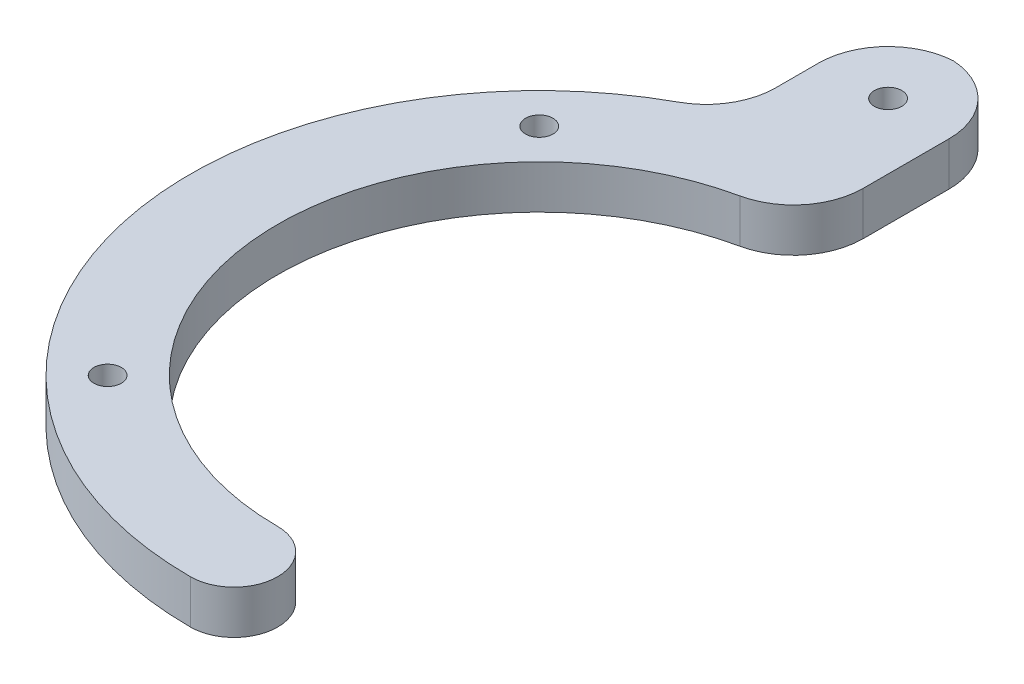
ISO-10303-21;
HEADER;
FILE_DESCRIPTION(('STEP AP214'),'2;1');
FILE_NAME('part.step','',(''),(''),'','','');
FILE_SCHEMA(('AUTOMOTIVE_DESIGN { 1 0 10303 214 1 1 1 1 }'));
ENDSEC;
DATA;
#1=APPLICATION_CONTEXT('core data for automotive mechanical design processes');
#2=APPLICATION_PROTOCOL_DEFINITION('international standard','automotive_design',2000,#1);
#3=PRODUCT_CONTEXT('',#1,'mechanical');
#4=PRODUCT('Part','Part','',(#3));
#5=PRODUCT_RELATED_PRODUCT_CATEGORY('part','',(#4));
#6=PRODUCT_DEFINITION_FORMATION('','',#4);
#7=PRODUCT_DEFINITION_CONTEXT('part definition',#1,'design');
#8=PRODUCT_DEFINITION('design','',#6,#7);
#9=PRODUCT_DEFINITION_SHAPE('','',#8);
#10=(LENGTH_UNIT() NAMED_UNIT(*) SI_UNIT(.MILLI.,.METRE.));
#11=(NAMED_UNIT(*) PLANE_ANGLE_UNIT() SI_UNIT($,.RADIAN.));
#12=(NAMED_UNIT(*) SI_UNIT($,.STERADIAN.) SOLID_ANGLE_UNIT());
#13=UNCERTAINTY_MEASURE_WITH_UNIT(LENGTH_MEASURE(1.E-05),#10,'distance_accuracy_value','');
#14=(GEOMETRIC_REPRESENTATION_CONTEXT(3) GLOBAL_UNCERTAINTY_ASSIGNED_CONTEXT((#13)) GLOBAL_UNIT_ASSIGNED_CONTEXT((#10,
#11,#12)) REPRESENTATION_CONTEXT('',''));
#15=CARTESIAN_POINT('',(0.,0.,0.));
#16=DIRECTION('',(0.,0.,1.));
#17=DIRECTION('',(1.,0.,0.));
#18=AXIS2_PLACEMENT_3D('',#15,#16,#17);
#19=CARTESIAN_POINT('',(19.05,6.35,114.3));
#20=DIRECTION('',(0.,-1.,0.));
#21=DIRECTION('',(0.,0.,-1.));
#22=AXIS2_PLACEMENT_3D('',#19,#20,#21);
#23=CYLINDRICAL_SURFACE('',#22,6.34999999999999);
#24=CARTESIAN_POINT('',(19.05,0.,114.3));
#25=DIRECTION('',(0.,1.,0.));
#26=DIRECTION('',(0.,0.,1.));
#27=AXIS2_PLACEMENT_3D('',#24,#25,#26);
#28=CIRCLE('',#27,6.34999999999999);
#29=CARTESIAN_POINT('',(19.05,0.,107.95));
#30=VERTEX_POINT('',#29);
#31=CARTESIAN_POINT('',(19.05,0.,120.65));
#32=VERTEX_POINT('',#31);
#33=EDGE_CURVE('E122',#30,#32,#28,.F.);
#34=ORIENTED_EDGE('',*,*,#33,.F.);
#35=DIRECTION('',(0.,-1.,0.));
#36=VECTOR('',#35,1.);
#37=CARTESIAN_POINT('',(19.05,6.35,107.95));
#38=LINE('',#37,#36);
#39=CARTESIAN_POINT('',(19.05,6.35,107.95));
#40=VERTEX_POINT('',#39);
#41=EDGE_CURVE('E111',#40,#30,#38,.T.);
#42=ORIENTED_EDGE('',*,*,#41,.F.);
#43=CARTESIAN_POINT('',(19.05,6.35,114.3));
#44=DIRECTION('',(0.,1.,0.));
#45=DIRECTION('',(0.,0.,1.));
#46=AXIS2_PLACEMENT_3D('',#43,#44,#45);
#47=CIRCLE('',#46,6.34999999999999);
#48=CARTESIAN_POINT('',(19.05,6.35,120.65));
#49=VERTEX_POINT('',#48);
#50=EDGE_CURVE('E116',#40,#49,#47,.F.);
#51=ORIENTED_EDGE('',*,*,#50,.T.);
#52=DIRECTION('',(0.,-1.,0.));
#53=VECTOR('',#52,1.);
#54=CARTESIAN_POINT('',(19.05,6.35,120.65));
#55=LINE('',#54,#53);
#56=EDGE_CURVE('E124',#49,#32,#55,.T.);
#57=ORIENTED_EDGE('',*,*,#56,.T.);
#58=EDGE_LOOP('',(#34,#42,#51,#57));
#59=FACE_BOUND('',#58,.T.);
#60=ADVANCED_FACE('F37',(#59),#23,.T.);
#61=CARTESIAN_POINT('',(19.05,6.35,69.85));
#62=DIRECTION('',(0.,-1.,0.));
#63=DIRECTION('',(0.,0.,-1.));
#64=AXIS2_PLACEMENT_3D('',#61,#62,#63);
#65=CYLINDRICAL_SURFACE('',#64,38.1);
#66=CARTESIAN_POINT('',(19.05,0.,69.85));
#67=DIRECTION('',(0.,1.,0.));
#68=DIRECTION('',(0.,0.,1.));
#69=AXIS2_PLACEMENT_3D('',#66,#67,#68);
#70=CIRCLE('',#69,38.1);
#71=CARTESIAN_POINT('',(11.0289473684211,0.,32.6038899389286));
#72=VERTEX_POINT('',#71);
#73=EDGE_CURVE('E153',#72,#30,#70,.T.);
#74=ORIENTED_EDGE('',*,*,#73,.F.);
#75=DIRECTION('',(0.,-1.,0.));
#76=VECTOR('',#75,1.);
#77=CARTESIAN_POINT('',(11.0289473684211,6.35,32.6038899389286));
#78=LINE('',#77,#76);
#79=CARTESIAN_POINT('',(11.0289473684211,6.35,32.6038899389286));
#80=VERTEX_POINT('',#79);
#81=EDGE_CURVE('E61',#72,#80,#78,.F.);
#82=ORIENTED_EDGE('',*,*,#81,.T.);
#83=CARTESIAN_POINT('',(19.05,6.35,69.85));
#84=DIRECTION('',(0.,1.,0.));
#85=DIRECTION('',(0.,0.,1.));
#86=AXIS2_PLACEMENT_3D('',#83,#84,#85);
#87=CIRCLE('',#86,38.1);
#88=EDGE_CURVE('E108',#80,#40,#87,.T.);
#89=ORIENTED_EDGE('',*,*,#88,.T.);
#90=ORIENTED_EDGE('',*,*,#41,.T.);
#91=EDGE_LOOP('',(#74,#82,#89,#90));
#92=FACE_BOUND('',#91,.T.);
#93=ADVANCED_FACE('F110',(#92),#65,.F.);
#94=CARTESIAN_POINT('',(19.05,6.35,0.));
#95=DIRECTION('',(-1.,0.,0.));
#96=DIRECTION('',(0.,0.,1.));
#97=AXIS2_PLACEMENT_3D('',#94,#95,#96);
#98=PLANE('',#97);
#99=DIRECTION('',(0.,0.,-1.));
#100=VECTOR('',#99,1.);
#101=CARTESIAN_POINT('',(19.05,6.35,0.));
#102=LINE('',#101,#100);
#103=CARTESIAN_POINT('',(19.05,6.35,22.6715939226429));
#104=VERTEX_POINT('',#103);
#105=CARTESIAN_POINT('',(19.05,6.35,10.16));
#106=VERTEX_POINT('',#105);
#107=EDGE_CURVE('E115',#104,#106,#102,.T.);
#108=ORIENTED_EDGE('',*,*,#107,.F.);
#109=DIRECTION('',(0.,1.,0.));
#110=VECTOR('',#109,1.);
#111=CARTESIAN_POINT('',(19.05,0.,22.6715939226429));
#112=LINE('',#111,#110);
#113=CARTESIAN_POINT('',(19.05,0.,22.6715939226429));
#114=VERTEX_POINT('',#113);
#115=EDGE_CURVE('E176',#104,#114,#112,.F.);
#116=ORIENTED_EDGE('',*,*,#115,.T.);
#117=DIRECTION('',(0.,0.,-1.));
#118=VECTOR('',#117,1.);
#119=CARTESIAN_POINT('',(19.05,0.,0.));
#120=LINE('',#119,#118);
#121=CARTESIAN_POINT('',(19.05,0.,10.16));
#122=VERTEX_POINT('',#121);
#123=EDGE_CURVE('E155',#114,#122,#120,.T.);
#124=ORIENTED_EDGE('',*,*,#123,.T.);
#125=DIRECTION('',(0.,-1.,0.));
#126=VECTOR('',#125,1.);
#127=CARTESIAN_POINT('',(19.05,6.35,10.16));
#128=LINE('',#127,#126);
#129=EDGE_CURVE('E174',#122,#106,#128,.F.);
#130=ORIENTED_EDGE('',*,*,#129,.T.);
#131=EDGE_LOOP('',(#108,#116,#124,#130));
#132=FACE_BOUND('',#131,.T.);
#133=ADVANCED_FACE('F213',(#132),#98,.F.);
#134=CARTESIAN_POINT('',(0.,6.35,0.));
#135=DIRECTION('',(1.,0.,0.));
#136=DIRECTION('',(0.,0.,-1.));
#137=AXIS2_PLACEMENT_3D('',#134,#135,#136);
#138=PLANE('',#137);
#139=DIRECTION('',(0.,0.,1.));
#140=VECTOR('',#139,1.);
#141=CARTESIAN_POINT('',(0.,0.,0.));
#142=LINE('',#141,#140);
#143=CARTESIAN_POINT('',(0.,0.,10.16));
#144=VERTEX_POINT('',#143);
#145=CARTESIAN_POINT('',(0.,0.,16.3439489403301));
#146=VERTEX_POINT('',#145);
#147=EDGE_CURVE('E158',#144,#146,#142,.T.);
#148=ORIENTED_EDGE('',*,*,#147,.T.);
#149=DIRECTION('',(0.,1.,0.));
#150=VECTOR('',#149,1.);
#151=CARTESIAN_POINT('',(0.,6.35,16.3439489403301));
#152=LINE('',#151,#150);
#153=CARTESIAN_POINT('',(0.,6.35,16.3439489403301));
#154=VERTEX_POINT('',#153);
#155=EDGE_CURVE('E172',#146,#154,#152,.T.);
#156=ORIENTED_EDGE('',*,*,#155,.T.);
#157=DIRECTION('',(0.,0.,1.));
#158=VECTOR('',#157,1.);
#159=CARTESIAN_POINT('',(0.,6.35,0.));
#160=LINE('',#159,#158);
#161=CARTESIAN_POINT('',(0.,6.35,10.16));
#162=VERTEX_POINT('',#161);
#163=EDGE_CURVE('E139',#162,#154,#160,.T.);
#164=ORIENTED_EDGE('',*,*,#163,.F.);
#165=DIRECTION('',(0.,-1.,0.));
#166=VECTOR('',#165,1.);
#167=CARTESIAN_POINT('',(0.,0.,10.16));
#168=LINE('',#167,#166);
#169=EDGE_CURVE('E169',#162,#144,#168,.T.);
#170=ORIENTED_EDGE('',*,*,#169,.T.);
#171=EDGE_LOOP('',(#148,#156,#164,#170));
#172=FACE_BOUND('',#171,.T.);
#173=ADVANCED_FACE('F201',(#172),#138,.F.);
#174=CARTESIAN_POINT('',(19.05,6.35,69.85));
#175=DIRECTION('',(0.,-1.,0.));
#176=DIRECTION('',(0.,0.,-1.));
#177=AXIS2_PLACEMENT_3D('',#174,#175,#176);
#178=CYLINDRICAL_SURFACE('',#177,50.8);
#179=CARTESIAN_POINT('',(19.05,6.35,69.85));
#180=DIRECTION('',(0.,1.,0.));
#181=DIRECTION('',(0.,0.,1.));
#182=AXIS2_PLACEMENT_3D('',#179,#180,#181);
#183=CIRCLE('',#182,50.8);
#184=CARTESIAN_POINT('',(-5.29166666666666,6.35,25.2616241169418));
#185=VERTEX_POINT('',#184);
#186=EDGE_CURVE('E129',#185,#49,#183,.T.);
#187=ORIENTED_EDGE('',*,*,#186,.F.);
#188=DIRECTION('',(0.,-1.,0.));
#189=VECTOR('',#188,1.);
#190=CARTESIAN_POINT('',(-5.29166666666667,6.35,25.2616241169418));
#191=LINE('',#190,#189);
#192=CARTESIAN_POINT('',(-5.29166666666666,0.,25.2616241169418));
#193=VERTEX_POINT('',#192);
#194=EDGE_CURVE('E123',#185,#193,#191,.T.);
#195=ORIENTED_EDGE('',*,*,#194,.T.);
#196=CARTESIAN_POINT('',(19.05,0.,69.85));
#197=DIRECTION('',(0.,1.,0.));
#198=DIRECTION('',(0.,0.,1.));
#199=AXIS2_PLACEMENT_3D('',#196,#197,#198);
#200=CIRCLE('',#199,50.8);
#201=EDGE_CURVE('E161',#193,#32,#200,.T.);
#202=ORIENTED_EDGE('',*,*,#201,.T.);
#203=ORIENTED_EDGE('',*,*,#56,.F.);
#204=EDGE_LOOP('',(#187,#195,#202,#203));
#205=FACE_BOUND('',#204,.T.);
#206=ADVANCED_FACE('F207',(#205),#178,.T.);
#207=CARTESIAN_POINT('',(-12.3808964237419,6.35,38.4191035762578));
#208=DIRECTION('',(0.,-1.,0.));
#209=DIRECTION('',(0.,0.,-1.));
#210=AXIS2_PLACEMENT_3D('',#207,#208,#209);
#211=CYLINDRICAL_SURFACE('',#210,1.99999999999997);
#212=CARTESIAN_POINT('',(-12.3808964237419,6.35,38.4191035762578));
#213=DIRECTION('',(0.,1.,0.));
#214=DIRECTION('',(0.,0.,1.));
#215=AXIS2_PLACEMENT_3D('',#212,#213,#214);
#216=CIRCLE('',#215,1.99999999999997);
#217=CARTESIAN_POINT('',(-12.3808964237419,6.35,40.4191035762578));
#218=VERTEX_POINT('',#217);
#219=EDGE_CURVE('E131',#218,#218,#216,.T.);
#220=ORIENTED_EDGE('',*,*,#219,.T.);
#221=EDGE_LOOP('',(#220));
#222=FACE_BOUND('',#221,.T.);
#223=CARTESIAN_POINT('',(-12.3808964237419,0.,38.4191035762578));
#224=DIRECTION('',(0.,1.,0.));
#225=DIRECTION('',(0.,0.,1.));
#226=AXIS2_PLACEMENT_3D('',#223,#224,#225);
#227=CIRCLE('',#226,1.99999999999997);
#228=CARTESIAN_POINT('',(-12.3808964237419,0.,40.4191035762578));
#229=VERTEX_POINT('',#228);
#230=EDGE_CURVE('E149',#229,#229,#227,.T.);
#231=ORIENTED_EDGE('',*,*,#230,.F.);
#232=EDGE_LOOP('',(#231));
#233=FACE_BOUND('',#232,.T.);
#234=ADVANCED_FACE('F234',(#222,#233),#211,.F.);
#235=CARTESIAN_POINT('',(-12.3808964237421,6.35,101.280896423742));
#236=DIRECTION('',(0.,-1.,0.));
#237=DIRECTION('',(0.,0.,-1.));
#238=AXIS2_PLACEMENT_3D('',#235,#236,#237);
#239=CYLINDRICAL_SURFACE('',#238,2.);
#240=CARTESIAN_POINT('',(-12.3808964237421,6.35,101.280896423742));
#241=DIRECTION('',(0.,1.,0.));
#242=DIRECTION('',(0.,0.,1.));
#243=AXIS2_PLACEMENT_3D('',#240,#241,#242);
#244=CIRCLE('',#243,2.);
#245=CARTESIAN_POINT('',(-12.3808964237421,6.35,103.280896423742));
#246=VERTEX_POINT('',#245);
#247=EDGE_CURVE('E134',#246,#246,#244,.T.);
#248=ORIENTED_EDGE('',*,*,#247,.T.);
#249=EDGE_LOOP('',(#248));
#250=FACE_BOUND('',#249,.T.);
#251=CARTESIAN_POINT('',(-12.3808964237421,0.,101.280896423742));
#252=DIRECTION('',(0.,1.,0.));
#253=DIRECTION('',(0.,0.,1.));
#254=AXIS2_PLACEMENT_3D('',#251,#252,#253);
#255=CIRCLE('',#254,2.);
#256=CARTESIAN_POINT('',(-12.3808964237421,0.,103.280896423742));
#257=VERTEX_POINT('',#256);
#258=EDGE_CURVE('E146',#257,#257,#255,.T.);
#259=ORIENTED_EDGE('',*,*,#258,.F.);
#260=EDGE_LOOP('',(#259));
#261=FACE_BOUND('',#260,.T.);
#262=ADVANCED_FACE('F237',(#250,#261),#239,.F.);
#263=CARTESIAN_POINT('',(9.525,6.35,9.525));
#264=DIRECTION('',(0.,-1.,0.));
#265=DIRECTION('',(0.,0.,-1.));
#266=AXIS2_PLACEMENT_3D('',#263,#264,#265);
#267=CYLINDRICAL_SURFACE('',#266,2.);
#268=CARTESIAN_POINT('',(9.525,6.35,9.525));
#269=DIRECTION('',(0.,1.,0.));
#270=DIRECTION('',(0.,0.,1.));
#271=AXIS2_PLACEMENT_3D('',#268,#269,#270);
#272=CIRCLE('',#271,2.);
#273=CARTESIAN_POINT('',(9.525,6.35,11.525));
#274=VERTEX_POINT('',#273);
#275=EDGE_CURVE('E143',#274,#274,#272,.T.);
#276=ORIENTED_EDGE('',*,*,#275,.T.);
#277=EDGE_LOOP('',(#276));
#278=FACE_BOUND('',#277,.T.);
#279=CARTESIAN_POINT('',(9.525,0.,9.525));
#280=DIRECTION('',(0.,1.,0.));
#281=DIRECTION('',(0.,0.,1.));
#282=AXIS2_PLACEMENT_3D('',#279,#280,#281);
#283=CIRCLE('',#282,2.);
#284=CARTESIAN_POINT('',(9.525,0.,11.525));
#285=VERTEX_POINT('',#284);
#286=EDGE_CURVE('E163',#285,#285,#283,.T.);
#287=ORIENTED_EDGE('',*,*,#286,.F.);
#288=EDGE_LOOP('',(#287));
#289=FACE_BOUND('',#288,.T.);
#290=ADVANCED_FACE('F241',(#278,#289),#267,.F.);
#291=CARTESIAN_POINT('',(0.,6.35,0.));
#292=DIRECTION('',(0.,1.,0.));
#293=DIRECTION('',(0.,0.,1.));
#294=AXIS2_PLACEMENT_3D('',#291,#292,#293);
#295=PLANE('',#294);
#296=ORIENTED_EDGE('',*,*,#247,.F.);
#297=EDGE_LOOP('',(#296));
#298=FACE_BOUND('',#297,.T.);
#299=ORIENTED_EDGE('',*,*,#219,.F.);
#300=EDGE_LOOP('',(#299));
#301=FACE_BOUND('',#300,.T.);
#302=ORIENTED_EDGE('',*,*,#88,.F.);
#303=CARTESIAN_POINT('',(8.89,6.35,22.6715939226429));
#304=DIRECTION('',(0.,1.,0.));
#305=DIRECTION('',(0.,0.,1.));
#306=AXIS2_PLACEMENT_3D('',#303,#304,#305);
#307=CIRCLE('',#306,10.16);
#308=EDGE_CURVE('E189',#80,#104,#307,.T.);
#309=ORIENTED_EDGE('',*,*,#308,.T.);
#310=ORIENTED_EDGE('',*,*,#107,.T.);
#311=CARTESIAN_POINT('',(8.88999999999999,6.35,10.16));
#312=DIRECTION('',(0.,1.,0.));
#313=DIRECTION('',(0.,0.,1.));
#314=AXIS2_PLACEMENT_3D('',#311,#312,#313);
#315=CIRCLE('',#314,10.16);
#316=CARTESIAN_POINT('',(9.525,6.35,0.0198631666037171));
#317=VERTEX_POINT('',#316);
#318=EDGE_CURVE('E53',#106,#317,#315,.T.);
#319=ORIENTED_EDGE('',*,*,#318,.T.);
#320=CARTESIAN_POINT('',(10.16,6.35,10.16));
#321=DIRECTION('',(0.,1.,0.));
#322=DIRECTION('',(0.,0.,1.));
#323=AXIS2_PLACEMENT_3D('',#320,#321,#322);
#324=CIRCLE('',#323,10.16);
#325=EDGE_CURVE('E187',#317,#162,#324,.T.);
#326=ORIENTED_EDGE('',*,*,#325,.T.);
#327=ORIENTED_EDGE('',*,*,#163,.T.);
#328=CARTESIAN_POINT('',(-10.16,6.35,16.3439489403301));
#329=DIRECTION('',(0.,1.,0.));
#330=DIRECTION('',(0.,0.,1.));
#331=AXIS2_PLACEMENT_3D('',#328,#329,#330);
#332=CIRCLE('',#331,10.16);
#333=EDGE_CURVE('E11',#154,#185,#332,.F.);
#334=ORIENTED_EDGE('',*,*,#333,.T.);
#335=ORIENTED_EDGE('',*,*,#186,.T.);
#336=ORIENTED_EDGE('',*,*,#50,.F.);
#337=EDGE_LOOP('',(#302,#309,#310,#319,#326,#327,#334,#335,#336));
#338=FACE_BOUND('',#337,.T.);
#339=ORIENTED_EDGE('',*,*,#275,.F.);
#340=EDGE_LOOP('',(#339));
#341=FACE_BOUND('',#340,.T.);
#342=ADVANCED_FACE('F126',(#298,#301,#338,#341),#295,.T.);
#343=CARTESIAN_POINT('',(0.,0.,0.));
#344=DIRECTION('',(0.,1.,0.));
#345=DIRECTION('',(0.,0.,1.));
#346=AXIS2_PLACEMENT_3D('',#343,#344,#345);
#347=PLANE('',#346);
#348=ORIENTED_EDGE('',*,*,#258,.T.);
#349=EDGE_LOOP('',(#348));
#350=FACE_BOUND('',#349,.T.);
#351=ORIENTED_EDGE('',*,*,#230,.T.);
#352=EDGE_LOOP('',(#351));
#353=FACE_BOUND('',#352,.T.);
#354=ORIENTED_EDGE('',*,*,#123,.F.);
#355=CARTESIAN_POINT('',(8.89,0.,22.6715939226429));
#356=DIRECTION('',(0.,1.,0.));
#357=DIRECTION('',(0.,0.,1.));
#358=AXIS2_PLACEMENT_3D('',#355,#356,#357);
#359=CIRCLE('',#358,10.16);
#360=EDGE_CURVE('E183',#114,#72,#359,.F.);
#361=ORIENTED_EDGE('',*,*,#360,.T.);
#362=ORIENTED_EDGE('',*,*,#73,.T.);
#363=ORIENTED_EDGE('',*,*,#33,.T.);
#364=ORIENTED_EDGE('',*,*,#201,.F.);
#365=CARTESIAN_POINT('',(-10.16,0.,16.3439489403301));
#366=DIRECTION('',(0.,1.,0.));
#367=DIRECTION('',(0.,0.,1.));
#368=AXIS2_PLACEMENT_3D('',#365,#366,#367);
#369=CIRCLE('',#368,10.16);
#370=EDGE_CURVE('E46',#193,#146,#369,.T.);
#371=ORIENTED_EDGE('',*,*,#370,.T.);
#372=ORIENTED_EDGE('',*,*,#147,.F.);
#373=CARTESIAN_POINT('',(10.16,0.,10.16));
#374=DIRECTION('',(0.,1.,0.));
#375=DIRECTION('',(0.,0.,1.));
#376=AXIS2_PLACEMENT_3D('',#373,#374,#375);
#377=CIRCLE('',#376,10.16);
#378=CARTESIAN_POINT('',(9.525,0.,0.0198631666037171));
#379=VERTEX_POINT('',#378);
#380=EDGE_CURVE('E181',#144,#379,#377,.F.);
#381=ORIENTED_EDGE('',*,*,#380,.T.);
#382=CARTESIAN_POINT('',(8.88999999999999,0.,10.16));
#383=DIRECTION('',(0.,1.,0.));
#384=DIRECTION('',(0.,0.,1.));
#385=AXIS2_PLACEMENT_3D('',#382,#383,#384);
#386=CIRCLE('',#385,10.16);
#387=EDGE_CURVE('E179',#379,#122,#386,.F.);
#388=ORIENTED_EDGE('',*,*,#387,.T.);
#389=EDGE_LOOP('',(#354,#361,#362,#363,#364,#371,#372,#381,#388));
#390=FACE_BOUND('',#389,.T.);
#391=ORIENTED_EDGE('',*,*,#286,.T.);
#392=EDGE_LOOP('',(#391));
#393=FACE_BOUND('',#392,.T.);
#394=ADVANCED_FACE('F195',(#350,#353,#390,#393),#347,.F.);
#395=CARTESIAN_POINT('',(-10.16,6.35,16.3439489403301));
#396=DIRECTION('',(0.,-1.,0.));
#397=DIRECTION('',(0.,0.,-1.));
#398=AXIS2_PLACEMENT_3D('',#395,#396,#397);
#399=CYLINDRICAL_SURFACE('',#398,10.16);
#400=ORIENTED_EDGE('',*,*,#333,.F.);
#401=ORIENTED_EDGE('',*,*,#155,.F.);
#402=ORIENTED_EDGE('',*,*,#370,.F.);
#403=ORIENTED_EDGE('',*,*,#194,.F.);
#404=EDGE_LOOP('',(#400,#401,#402,#403));
#405=FACE_BOUND('',#404,.T.);
#406=ADVANCED_FACE('F205',(#405),#399,.F.);
#407=CARTESIAN_POINT('',(8.89,6.35,22.6715939226429));
#408=DIRECTION('',(0.,-1.,0.));
#409=DIRECTION('',(0.,0.,-1.));
#410=AXIS2_PLACEMENT_3D('',#407,#408,#409);
#411=CYLINDRICAL_SURFACE('',#410,10.16);
#412=ORIENTED_EDGE('',*,*,#308,.F.);
#413=ORIENTED_EDGE('',*,*,#81,.F.);
#414=ORIENTED_EDGE('',*,*,#360,.F.);
#415=ORIENTED_EDGE('',*,*,#115,.F.);
#416=EDGE_LOOP('',(#412,#413,#414,#415));
#417=FACE_BOUND('',#416,.T.);
#418=ADVANCED_FACE('F209',(#417),#411,.T.);
#419=CARTESIAN_POINT('',(8.88999999999999,6.35,10.16));
#420=DIRECTION('',(0.,1.,0.));
#421=DIRECTION('',(0.,0.,1.));
#422=AXIS2_PLACEMENT_3D('',#419,#420,#421);
#423=CYLINDRICAL_SURFACE('',#422,10.16);
#424=DIRECTION('',(0.,1.,0.));
#425=VECTOR('',#424,1.);
#426=CARTESIAN_POINT('',(9.525,3.175,0.0198631666037171));
#427=LINE('',#426,#425);
#428=EDGE_CURVE('E41',#317,#379,#427,.F.);
#429=ORIENTED_EDGE('',*,*,#428,.F.);
#430=ORIENTED_EDGE('',*,*,#318,.F.);
#431=ORIENTED_EDGE('',*,*,#129,.F.);
#432=ORIENTED_EDGE('',*,*,#387,.F.);
#433=EDGE_LOOP('',(#429,#430,#431,#432));
#434=FACE_BOUND('',#433,.T.);
#435=ADVANCED_FACE('F39',(#434),#423,.T.);
#436=CARTESIAN_POINT('',(10.16,6.35,10.16));
#437=DIRECTION('',(0.,1.,0.));
#438=DIRECTION('',(0.,0.,1.));
#439=AXIS2_PLACEMENT_3D('',#436,#437,#438);
#440=CYLINDRICAL_SURFACE('',#439,10.16);
#441=ORIENTED_EDGE('',*,*,#325,.F.);
#442=ORIENTED_EDGE('',*,*,#428,.T.);
#443=ORIENTED_EDGE('',*,*,#380,.F.);
#444=ORIENTED_EDGE('',*,*,#169,.F.);
#445=EDGE_LOOP('',(#441,#442,#443,#444));
#446=FACE_BOUND('',#445,.T.);
#447=ADVANCED_FACE('F220',(#446),#440,.T.);
#448=CLOSED_SHELL('',(#60,#93,#133,#173,#206,#234,#262,#290,#342,#394,#406,#418,#435,#447));
#449=MANIFOLD_SOLID_BREP('B2',#448);
#450=ADVANCED_BREP_SHAPE_REPRESENTATION('',(#18,#449),#14);
#451=SHAPE_DEFINITION_REPRESENTATION(#9,#450);
ENDSEC;
END-ISO-10303-21;
